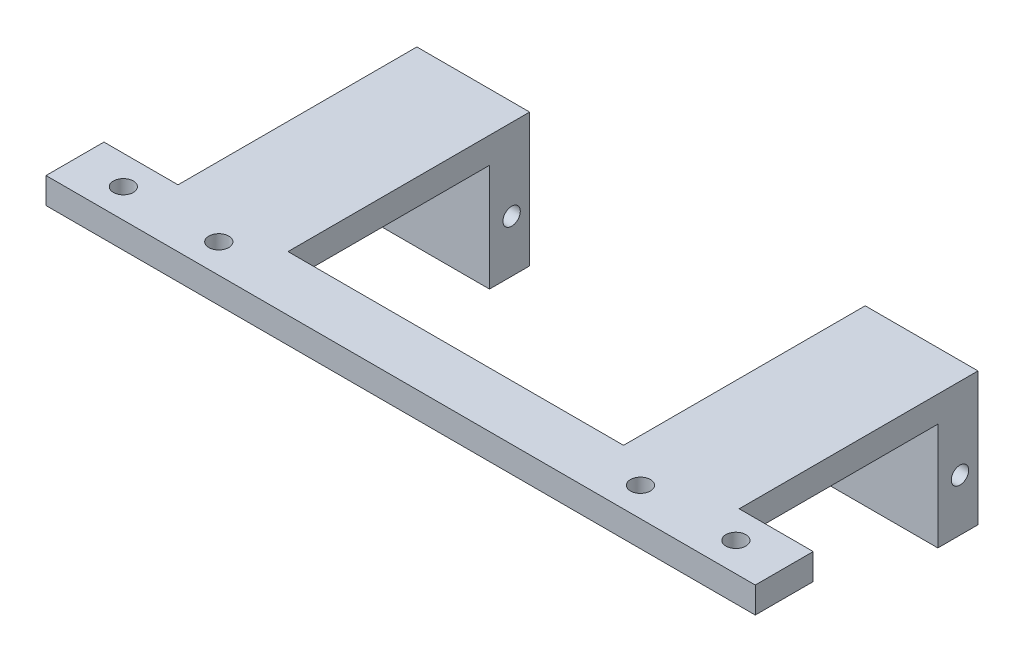
ISO-10303-21;
HEADER;
FILE_DESCRIPTION(('STEP AP214'),'2;1');
FILE_NAME('part.step','',(''),(''),'','','');
FILE_SCHEMA(('AUTOMOTIVE_DESIGN { 1 0 10303 214 1 1 1 1 }'));
ENDSEC;
DATA;
#1=APPLICATION_CONTEXT('core data for automotive mechanical design processes');
#2=APPLICATION_PROTOCOL_DEFINITION('international standard','automotive_design',2000,#1);
#3=PRODUCT_CONTEXT('',#1,'mechanical');
#4=PRODUCT('Part','Part','',(#3));
#5=PRODUCT_RELATED_PRODUCT_CATEGORY('part','',(#4));
#6=PRODUCT_DEFINITION_FORMATION('','',#4);
#7=PRODUCT_DEFINITION_CONTEXT('part definition',#1,'design');
#8=PRODUCT_DEFINITION('design','',#6,#7);
#9=PRODUCT_DEFINITION_SHAPE('','',#8);
#10=(LENGTH_UNIT() NAMED_UNIT(*) SI_UNIT(.MILLI.,.METRE.));
#11=(NAMED_UNIT(*) PLANE_ANGLE_UNIT() SI_UNIT($,.RADIAN.));
#12=(NAMED_UNIT(*) SI_UNIT($,.STERADIAN.) SOLID_ANGLE_UNIT());
#13=UNCERTAINTY_MEASURE_WITH_UNIT(LENGTH_MEASURE(1.E-05),#10,'distance_accuracy_value','');
#14=(GEOMETRIC_REPRESENTATION_CONTEXT(3) GLOBAL_UNCERTAINTY_ASSIGNED_CONTEXT((#13)) GLOBAL_UNIT_ASSIGNED_CONTEXT((#10,
#11,#12)) REPRESENTATION_CONTEXT('',''));
#15=CARTESIAN_POINT('',(0.,0.,0.));
#16=DIRECTION('',(0.,0.,1.));
#17=DIRECTION('',(1.,0.,0.));
#18=AXIS2_PLACEMENT_3D('',#15,#16,#17);
#19=CARTESIAN_POINT('',(32.5,70.4999984957278,6.27643567267014));
#20=DIRECTION('',(0.,1.,0.));
#21=DIRECTION('',(1.,0.,0.));
#22=AXIS2_PLACEMENT_3D('',#19,#20,#21);
#23=PLANE('',#22);
#24=CARTESIAN_POINT('',(56.8005550509677,70.4999984957278,20.0406324854805));
#25=DIRECTION('',(0.,-1.,0.));
#26=DIRECTION('',(1.,0.,0.));
#27=AXIS2_PLACEMENT_3D('',#24,#25,#26);
#28=CIRCLE('',#27,1.15);
#29=CARTESIAN_POINT('',(57.9505550509677,70.4999984957278,20.0406324854805));
#30=VERTEX_POINT('',#29);
#31=EDGE_CURVE('E11',#30,#30,#28,.T.);
#32=ORIENTED_EDGE('',*,*,#31,.T.);
#33=EDGE_LOOP('',(#32));
#34=FACE_BOUND('',#33,.T.);
#35=CARTESIAN_POINT('',(-2.8005550509677,70.4999984957278,20.0406324854805));
#36=DIRECTION('',(0.,-1.,0.));
#37=DIRECTION('',(1.,0.,0.));
#38=AXIS2_PLACEMENT_3D('',#35,#36,#37);
#39=CIRCLE('',#38,1.15);
#40=CARTESIAN_POINT('',(-1.6505550509677,70.4999984957278,20.0406324854805));
#41=VERTEX_POINT('',#40);
#42=EDGE_CURVE('E23',#41,#41,#39,.T.);
#43=ORIENTED_EDGE('',*,*,#42,.T.);
#44=EDGE_LOOP('',(#43));
#45=FACE_BOUND('',#44,.T.);
#46=CARTESIAN_POINT('',(67.8005550509677,70.4999984957278,20.0406324854805));
#47=DIRECTION('',(0.,-1.,0.));
#48=DIRECTION('',(1.,0.,0.));
#49=AXIS2_PLACEMENT_3D('',#46,#47,#48);
#50=CIRCLE('',#49,1.15);
#51=CARTESIAN_POINT('',(68.9505550509677,70.4999984957278,20.0406324854805));
#52=VERTEX_POINT('',#51);
#53=EDGE_CURVE('E325',#52,#52,#50,.T.);
#54=ORIENTED_EDGE('',*,*,#53,.T.);
#55=EDGE_LOOP('',(#54));
#56=FACE_BOUND('',#55,.T.);
#57=CARTESIAN_POINT('',(8.1994449490323,70.4999984957278,20.0406324854805));
#58=DIRECTION('',(0.,-1.,0.));
#59=DIRECTION('',(1.,0.,0.));
#60=AXIS2_PLACEMENT_3D('',#57,#58,#59);
#61=CIRCLE('',#60,1.15);
#62=CARTESIAN_POINT('',(9.3494449490323,70.4999984957278,20.0406324854805));
#63=VERTEX_POINT('',#62);
#64=EDGE_CURVE('E320',#63,#63,#61,.T.);
#65=ORIENTED_EDGE('',*,*,#64,.T.);
#66=EDGE_LOOP('',(#65));
#67=FACE_BOUND('',#66,.T.);
#68=DIRECTION('',(1.,0.,0.));
#69=VECTOR('',#68,1.);
#70=CARTESIAN_POINT('',(0.161137255349864,70.4999984957278,23.3812649709613));
#71=LINE('',#70,#69);
#72=CARTESIAN_POINT('',(-8.37603999629014,70.4999984957278,23.3812649709613));
#73=VERTEX_POINT('',#72);
#74=CARTESIAN_POINT('',(73.3760399962901,70.4999984957278,23.3812649709613));
#75=VERTEX_POINT('',#74);
#76=EDGE_CURVE('E30',#73,#75,#71,.T.);
#77=ORIENTED_EDGE('',*,*,#76,.T.);
#78=DIRECTION('',(0.,0.,-1.));
#79=VECTOR('',#78,1.);
#80=CARTESIAN_POINT('',(73.3760399962901,70.4999984957278,23.3812649709613));
#81=LINE('',#80,#79);
#82=CARTESIAN_POINT('',(73.3760399962901,70.4999984957278,16.6999999999997));
#83=VERTEX_POINT('',#82);
#84=EDGE_CURVE('E35',#75,#83,#81,.T.);
#85=ORIENTED_EDGE('',*,*,#84,.T.);
#86=DIRECTION('',(-1.,0.,0.));
#87=VECTOR('',#86,1.);
#88=CARTESIAN_POINT('',(32.5,70.4999984957278,16.6999999999997));
#89=LINE('',#88,#87);
#90=CARTESIAN_POINT('',(64.8388627446501,70.4999984957278,16.6999999999997));
#91=VERTEX_POINT('',#90);
#92=EDGE_CURVE('E314',#83,#91,#89,.T.);
#93=ORIENTED_EDGE('',*,*,#92,.T.);
#94=DIRECTION('',(0.,0.,-1.));
#95=VECTOR('',#94,1.);
#96=CARTESIAN_POINT('',(64.8388627446501,70.4999984957278,23.3812649709613));
#97=LINE('',#96,#95);
#98=CARTESIAN_POINT('',(64.8388627446501,70.4999984957278,-10.828393625621));
#99=VERTEX_POINT('',#98);
#100=EDGE_CURVE('E312',#91,#99,#97,.T.);
#101=ORIENTED_EDGE('',*,*,#100,.T.);
#102=DIRECTION('',(-1.,0.,0.));
#103=VECTOR('',#102,1.);
#104=CARTESIAN_POINT('',(32.5,70.4999984957278,-10.828393625621));
#105=LINE('',#104,#103);
#106=CARTESIAN_POINT('',(51.8388627446501,70.4999984957278,-10.828393625621));
#107=VERTEX_POINT('',#106);
#108=EDGE_CURVE('E308',#99,#107,#105,.T.);
#109=ORIENTED_EDGE('',*,*,#108,.T.);
#110=DIRECTION('',(0.,0.,1.));
#111=VECTOR('',#110,1.);
#112=CARTESIAN_POINT('',(51.8388627446501,70.4999984957278,-10.828393625621));
#113=LINE('',#112,#111);
#114=CARTESIAN_POINT('',(51.8388627446501,70.4999984957278,17.0268952281669));
#115=VERTEX_POINT('',#114);
#116=EDGE_CURVE('E304',#107,#115,#113,.T.);
#117=ORIENTED_EDGE('',*,*,#116,.T.);
#118=DIRECTION('',(-1.,0.,0.));
#119=VECTOR('',#118,1.);
#120=CARTESIAN_POINT('',(32.5,70.4999984957278,17.0268952281669));
#121=LINE('',#120,#119);
#122=CARTESIAN_POINT('',(13.1611372553499,70.4999984957278,17.0268952281669));
#123=VERTEX_POINT('',#122);
#124=EDGE_CURVE('E300',#115,#123,#121,.T.);
#125=ORIENTED_EDGE('',*,*,#124,.T.);
#126=DIRECTION('',(0.,0.,-1.));
#127=VECTOR('',#126,1.);
#128=CARTESIAN_POINT('',(13.1611372553499,70.4999984957278,23.3812649709613));
#129=LINE('',#128,#127);
#130=CARTESIAN_POINT('',(13.1611372553499,70.4999984957278,-10.828393625621));
#131=VERTEX_POINT('',#130);
#132=EDGE_CURVE('E296',#123,#131,#129,.T.);
#133=ORIENTED_EDGE('',*,*,#132,.T.);
#134=DIRECTION('',(-1.,0.,0.));
#135=VECTOR('',#134,1.);
#136=CARTESIAN_POINT('',(13.1611372553499,70.4999984957278,-10.828393625621));
#137=LINE('',#136,#135);
#138=CARTESIAN_POINT('',(0.161137255349866,70.4999984957278,-10.828393625621));
#139=VERTEX_POINT('',#138);
#140=EDGE_CURVE('E292',#131,#139,#137,.T.);
#141=ORIENTED_EDGE('',*,*,#140,.T.);
#142=DIRECTION('',(0.,0.,1.));
#143=VECTOR('',#142,1.);
#144=CARTESIAN_POINT('',(0.161137255349864,70.4999984957278,-10.828393625621));
#145=LINE('',#144,#143);
#146=CARTESIAN_POINT('',(0.161137255349866,70.4999984957278,16.6999999999997));
#147=VERTEX_POINT('',#146);
#148=EDGE_CURVE('E288',#139,#147,#145,.T.);
#149=ORIENTED_EDGE('',*,*,#148,.T.);
#150=DIRECTION('',(-1.,0.,0.));
#151=VECTOR('',#150,1.);
#152=CARTESIAN_POINT('',(-8.37603999629014,70.4999984957278,16.6999999999997));
#153=LINE('',#152,#151);
#154=CARTESIAN_POINT('',(-8.37603999629014,70.4999984957278,16.6999999999997));
#155=VERTEX_POINT('',#154);
#156=EDGE_CURVE('E284',#147,#155,#153,.T.);
#157=ORIENTED_EDGE('',*,*,#156,.T.);
#158=DIRECTION('',(0.,0.,1.));
#159=VECTOR('',#158,1.);
#160=CARTESIAN_POINT('',(-8.37603999629014,70.4999984957278,23.3812649709613));
#161=LINE('',#160,#159);
#162=EDGE_CURVE('E147',#155,#73,#161,.T.);
#163=ORIENTED_EDGE('',*,*,#162,.T.);
#164=EDGE_LOOP('',(#77,#85,#93,#101,#109,#117,#125,#133,#141,#149,#157,#163));
#165=FACE_BOUND('',#164,.T.);
#166=ADVANCED_FACE('F16',(#34,#45,#56,#67,#165),#23,.T.);
#167=CARTESIAN_POINT('',(-8.37603999629014,67.4999984957278,23.3812649709613));
#168=DIRECTION('',(0.,0.,1.));
#169=DIRECTION('',(1.,0.,0.));
#170=AXIS2_PLACEMENT_3D('',#167,#168,#169);
#171=PLANE('',#170);
#172=DIRECTION('',(-1.,0.,0.));
#173=VECTOR('',#172,1.);
#174=CARTESIAN_POINT('',(0.161137255349864,67.4999984957278,23.3812649709613));
#175=LINE('',#174,#173);
#176=CARTESIAN_POINT('',(73.3760399962901,67.4999984957278,23.3812649709613));
#177=VERTEX_POINT('',#176);
#178=CARTESIAN_POINT('',(-8.37603999629014,67.4999984957278,23.3812649709613));
#179=VERTEX_POINT('',#178);
#180=EDGE_CURVE('E152',#177,#179,#175,.T.);
#181=ORIENTED_EDGE('',*,*,#180,.F.);
#182=DIRECTION('',(0.,1.,0.));
#183=VECTOR('',#182,1.);
#184=CARTESIAN_POINT('',(73.3760399962901,67.4999984957278,23.3812649709613));
#185=LINE('',#184,#183);
#186=EDGE_CURVE('E274',#177,#75,#185,.T.);
#187=ORIENTED_EDGE('',*,*,#186,.T.);
#188=ORIENTED_EDGE('',*,*,#76,.F.);
#189=DIRECTION('',(0.,1.,0.));
#190=VECTOR('',#189,1.);
#191=CARTESIAN_POINT('',(-8.37603999629014,67.4999984957278,23.3812649709613));
#192=LINE('',#191,#190);
#193=EDGE_CURVE('E270',#179,#73,#192,.T.);
#194=ORIENTED_EDGE('',*,*,#193,.F.);
#195=EDGE_LOOP('',(#181,#187,#188,#194));
#196=FACE_BOUND('',#195,.T.);
#197=ADVANCED_FACE('F351',(#196),#171,.T.);
#198=CARTESIAN_POINT('',(73.3760399962901,67.4999984957278,23.3812649709613));
#199=DIRECTION('',(1.,0.,0.));
#200=DIRECTION('',(0.,0.,-1.));
#201=AXIS2_PLACEMENT_3D('',#198,#199,#200);
#202=PLANE('',#201);
#203=DIRECTION('',(0.,0.,-1.));
#204=VECTOR('',#203,1.);
#205=CARTESIAN_POINT('',(73.3760399962901,67.4999984957278,23.3812649709613));
#206=LINE('',#205,#204);
#207=CARTESIAN_POINT('',(73.3760399962901,67.4999984957278,16.6999999999997));
#208=VERTEX_POINT('',#207);
#209=EDGE_CURVE('E268',#177,#208,#206,.T.);
#210=ORIENTED_EDGE('',*,*,#209,.T.);
#211=DIRECTION('',(0.,1.,0.));
#212=VECTOR('',#211,1.);
#213=CARTESIAN_POINT('',(73.3760399962901,67.4999984957278,16.6999999999997));
#214=LINE('',#213,#212);
#215=EDGE_CURVE('E266',#208,#83,#214,.T.);
#216=ORIENTED_EDGE('',*,*,#215,.T.);
#217=ORIENTED_EDGE('',*,*,#84,.F.);
#218=ORIENTED_EDGE('',*,*,#186,.F.);
#219=EDGE_LOOP('',(#210,#216,#217,#218));
#220=FACE_BOUND('',#219,.T.);
#221=ADVANCED_FACE('F356',(#220),#202,.T.);
#222=CARTESIAN_POINT('',(0.161137255349864,67.4999984957278,16.6999999999997));
#223=DIRECTION('',(0.,0.,-1.));
#224=DIRECTION('',(-1.,0.,0.));
#225=AXIS2_PLACEMENT_3D('',#222,#223,#224);
#226=PLANE('',#225);
#227=DIRECTION('',(-1.,0.,0.));
#228=VECTOR('',#227,1.);
#229=CARTESIAN_POINT('',(0.161137255349864,67.4999984957278,16.6999999999997));
#230=LINE('',#229,#228);
#231=CARTESIAN_POINT('',(64.8388627446501,67.4999984957278,16.6999999999997));
#232=VERTEX_POINT('',#231);
#233=EDGE_CURVE('E264',#208,#232,#230,.T.);
#234=ORIENTED_EDGE('',*,*,#233,.T.);
#235=DIRECTION('',(0.,1.,0.));
#236=VECTOR('',#235,1.);
#237=CARTESIAN_POINT('',(64.8388627446501,67.4999984957278,16.6999999999997));
#238=LINE('',#237,#236);
#239=EDGE_CURVE('E261',#232,#91,#238,.T.);
#240=ORIENTED_EDGE('',*,*,#239,.T.);
#241=ORIENTED_EDGE('',*,*,#92,.F.);
#242=ORIENTED_EDGE('',*,*,#215,.F.);
#243=EDGE_LOOP('',(#234,#240,#241,#242));
#244=FACE_BOUND('',#243,.T.);
#245=ADVANCED_FACE('F363',(#244),#226,.T.);
#246=CARTESIAN_POINT('',(64.8388627446501,67.4999984957278,16.6999999999997));
#247=DIRECTION('',(1.,0.,0.));
#248=DIRECTION('',(0.,0.,-1.));
#249=AXIS2_PLACEMENT_3D('',#246,#247,#248);
#250=PLANE('',#249);
#251=CARTESIAN_POINT('',(64.8388627446501,61.1387157673979,-8.75));
#252=DIRECTION('',(-1.,0.,0.));
#253=DIRECTION('',(0.,1.,0.));
#254=AXIS2_PLACEMENT_3D('',#251,#252,#253);
#255=CIRCLE('',#254,1.);
#256=CARTESIAN_POINT('',(64.8388627446501,62.1387157673979,-8.75));
#257=VERTEX_POINT('',#256);
#258=EDGE_CURVE('E256',#257,#257,#255,.T.);
#259=ORIENTED_EDGE('',*,*,#258,.T.);
#260=EDGE_LOOP('',(#259));
#261=FACE_BOUND('',#260,.T.);
#262=DIRECTION('',(0.,0.,-1.));
#263=VECTOR('',#262,1.);
#264=CARTESIAN_POINT('',(64.8388627446501,67.4999984957278,23.3812649709613));
#265=LINE('',#264,#263);
#266=CARTESIAN_POINT('',(64.8388627446501,67.4999984957278,-6.20000000000025));
#267=VERTEX_POINT('',#266);
#268=EDGE_CURVE('E252',#232,#267,#265,.T.);
#269=ORIENTED_EDGE('',*,*,#268,.T.);
#270=DIRECTION('',(0.,-1.,0.));
#271=VECTOR('',#270,1.);
#272=CARTESIAN_POINT('',(64.8388627446501,67.4999984957278,-6.20000000000025));
#273=LINE('',#272,#271);
#274=CARTESIAN_POINT('',(64.8388627446501,55.1389984957278,-6.20000000000025));
#275=VERTEX_POINT('',#274);
#276=EDGE_CURVE('E248',#267,#275,#273,.T.);
#277=ORIENTED_EDGE('',*,*,#276,.T.);
#278=DIRECTION('',(0.,0.,1.));
#279=VECTOR('',#278,1.);
#280=CARTESIAN_POINT('',(64.8388627446501,55.1389984957278,-6.20000000000025));
#281=LINE('',#280,#279);
#282=CARTESIAN_POINT('',(64.8388627446501,55.1389984957278,-10.828393625621));
#283=VERTEX_POINT('',#282);
#284=EDGE_CURVE('E245',#283,#275,#281,.T.);
#285=ORIENTED_EDGE('',*,*,#284,.F.);
#286=DIRECTION('',(0.,1.,0.));
#287=VECTOR('',#286,1.);
#288=CARTESIAN_POINT('',(64.8388627446501,67.4999984957278,-10.828393625621));
#289=LINE('',#288,#287);
#290=EDGE_CURVE('E242',#283,#99,#289,.T.);
#291=ORIENTED_EDGE('',*,*,#290,.T.);
#292=ORIENTED_EDGE('',*,*,#100,.F.);
#293=ORIENTED_EDGE('',*,*,#239,.F.);
#294=EDGE_LOOP('',(#269,#277,#285,#291,#292,#293));
#295=FACE_BOUND('',#294,.T.);
#296=ADVANCED_FACE('F370',(#261,#295),#250,.T.);
#297=CARTESIAN_POINT('',(13.1611372553499,67.4999984957278,-10.828393625621));
#298=DIRECTION('',(0.,0.,-1.));
#299=DIRECTION('',(-1.,0.,0.));
#300=AXIS2_PLACEMENT_3D('',#297,#298,#299);
#301=PLANE('',#300);
#302=DIRECTION('',(0.,1.,0.));
#303=VECTOR('',#302,1.);
#304=CARTESIAN_POINT('',(51.8388627446501,67.4999984957278,-10.828393625621));
#305=LINE('',#304,#303);
#306=CARTESIAN_POINT('',(51.8388627446502,55.1389984957278,-10.828393625621));
#307=VERTEX_POINT('',#306);
#308=EDGE_CURVE('E239',#307,#107,#305,.T.);
#309=ORIENTED_EDGE('',*,*,#308,.T.);
#310=ORIENTED_EDGE('',*,*,#108,.F.);
#311=ORIENTED_EDGE('',*,*,#290,.F.);
#312=DIRECTION('',(1.,0.,0.));
#313=VECTOR('',#312,1.);
#314=CARTESIAN_POINT('',(58.3388627446502,55.1389984957278,-10.828393625621));
#315=LINE('',#314,#313);
#316=EDGE_CURVE('E236',#307,#283,#315,.T.);
#317=ORIENTED_EDGE('',*,*,#316,.F.);
#318=EDGE_LOOP('',(#309,#310,#311,#317));
#319=FACE_BOUND('',#318,.T.);
#320=ADVANCED_FACE('F373',(#319),#301,.T.);
#321=CARTESIAN_POINT('',(51.8388627446501,67.4999984957278,-10.828393625621));
#322=DIRECTION('',(-1.,0.,0.));
#323=DIRECTION('',(0.,0.,1.));
#324=AXIS2_PLACEMENT_3D('',#321,#322,#323);
#325=PLANE('',#324);
#326=CARTESIAN_POINT('',(51.8388627446501,61.1387157673979,-8.75));
#327=DIRECTION('',(1.,0.,0.));
#328=DIRECTION('',(0.,1.,0.));
#329=AXIS2_PLACEMENT_3D('',#326,#327,#328);
#330=CIRCLE('',#329,1.);
#331=CARTESIAN_POINT('',(51.8388627446501,62.1387157673979,-8.75));
#332=VERTEX_POINT('',#331);
#333=EDGE_CURVE('E231',#332,#332,#330,.T.);
#334=ORIENTED_EDGE('',*,*,#333,.T.);
#335=EDGE_LOOP('',(#334));
#336=FACE_BOUND('',#335,.T.);
#337=DIRECTION('',(0.,0.,1.));
#338=VECTOR('',#337,1.);
#339=CARTESIAN_POINT('',(51.8388627446501,67.4999984957278,-10.828393625621));
#340=LINE('',#339,#338);
#341=CARTESIAN_POINT('',(51.8388627446502,67.4999984957278,-6.20000000000025));
#342=VERTEX_POINT('',#341);
#343=CARTESIAN_POINT('',(51.8388627446501,67.4999984957278,17.0268952281669));
#344=VERTEX_POINT('',#343);
#345=EDGE_CURVE('E227',#342,#344,#340,.T.);
#346=ORIENTED_EDGE('',*,*,#345,.T.);
#347=DIRECTION('',(0.,1.,0.));
#348=VECTOR('',#347,1.);
#349=CARTESIAN_POINT('',(51.8388627446501,67.4999984957278,17.0268952281669));
#350=LINE('',#349,#348);
#351=EDGE_CURVE('E222',#344,#115,#350,.T.);
#352=ORIENTED_EDGE('',*,*,#351,.T.);
#353=ORIENTED_EDGE('',*,*,#116,.F.);
#354=ORIENTED_EDGE('',*,*,#308,.F.);
#355=DIRECTION('',(0.,0.,-1.));
#356=VECTOR('',#355,1.);
#357=CARTESIAN_POINT('',(51.8388627446502,55.1389984957278,-10.828393625621));
#358=LINE('',#357,#356);
#359=CARTESIAN_POINT('',(51.8388627446502,55.1389984957278,-6.20000000000025));
#360=VERTEX_POINT('',#359);
#361=EDGE_CURVE('E217',#360,#307,#358,.T.);
#362=ORIENTED_EDGE('',*,*,#361,.F.);
#363=DIRECTION('',(0.,-1.,0.));
#364=VECTOR('',#363,1.);
#365=CARTESIAN_POINT('',(51.8388627446502,67.4999984957278,-6.20000000000025));
#366=LINE('',#365,#364);
#367=EDGE_CURVE('E212',#342,#360,#366,.T.);
#368=ORIENTED_EDGE('',*,*,#367,.F.);
#369=EDGE_LOOP('',(#346,#352,#353,#354,#362,#368));
#370=FACE_BOUND('',#369,.T.);
#371=ADVANCED_FACE('F380',(#336,#370),#325,.T.);
#372=CARTESIAN_POINT('',(51.8388627446501,67.4999984957278,17.0268952281669));
#373=DIRECTION('',(0.,0.,-1.));
#374=DIRECTION('',(-1.,0.,0.));
#375=AXIS2_PLACEMENT_3D('',#372,#373,#374);
#376=PLANE('',#375);
#377=DIRECTION('',(1.,0.,0.));
#378=VECTOR('',#377,1.);
#379=CARTESIAN_POINT('',(32.5,67.4999984957278,17.0268952281669));
#380=LINE('',#379,#378);
#381=CARTESIAN_POINT('',(13.1611372553499,67.4999984957278,17.0268952281669));
#382=VERTEX_POINT('',#381);
#383=EDGE_CURVE('E207',#382,#344,#380,.T.);
#384=ORIENTED_EDGE('',*,*,#383,.F.);
#385=DIRECTION('',(0.,1.,0.));
#386=VECTOR('',#385,1.);
#387=CARTESIAN_POINT('',(13.1611372553499,67.4999984957278,17.0268952281669));
#388=LINE('',#387,#386);
#389=EDGE_CURVE('E204',#382,#123,#388,.T.);
#390=ORIENTED_EDGE('',*,*,#389,.T.);
#391=ORIENTED_EDGE('',*,*,#124,.F.);
#392=ORIENTED_EDGE('',*,*,#351,.F.);
#393=EDGE_LOOP('',(#384,#390,#391,#392));
#394=FACE_BOUND('',#393,.T.);
#395=ADVANCED_FACE('F383',(#394),#376,.T.);
#396=CARTESIAN_POINT('',(13.1611372553499,67.4999984957278,17.0268952281669));
#397=DIRECTION('',(1.,0.,0.));
#398=DIRECTION('',(0.,0.,-1.));
#399=AXIS2_PLACEMENT_3D('',#396,#397,#398);
#400=PLANE('',#399);
#401=CARTESIAN_POINT('',(13.1611372553499,61.1387157673979,-8.75));
#402=DIRECTION('',(-1.,0.,0.));
#403=DIRECTION('',(0.,1.,0.));
#404=AXIS2_PLACEMENT_3D('',#401,#402,#403);
#405=CIRCLE('',#404,1.);
#406=CARTESIAN_POINT('',(13.1611372553499,62.1387157673979,-8.75));
#407=VERTEX_POINT('',#406);
#408=EDGE_CURVE('E199',#407,#407,#405,.T.);
#409=ORIENTED_EDGE('',*,*,#408,.T.);
#410=EDGE_LOOP('',(#409));
#411=FACE_BOUND('',#410,.T.);
#412=DIRECTION('',(0.,0.,-1.));
#413=VECTOR('',#412,1.);
#414=CARTESIAN_POINT('',(13.1611372553499,67.4999984957278,23.3812649709613));
#415=LINE('',#414,#413);
#416=CARTESIAN_POINT('',(13.1611372553499,67.4999984957278,-6.20000000000025));
#417=VERTEX_POINT('',#416);
#418=EDGE_CURVE('E197',#382,#417,#415,.T.);
#419=ORIENTED_EDGE('',*,*,#418,.T.);
#420=DIRECTION('',(0.,-1.,0.));
#421=VECTOR('',#420,1.);
#422=CARTESIAN_POINT('',(13.1611372553499,67.4999984957278,-6.20000000000025));
#423=LINE('',#422,#421);
#424=CARTESIAN_POINT('',(13.1611372553499,55.1389984957278,-6.20000000000025));
#425=VERTEX_POINT('',#424);
#426=EDGE_CURVE('E195',#417,#425,#423,.T.);
#427=ORIENTED_EDGE('',*,*,#426,.T.);
#428=DIRECTION('',(0.,0.,1.));
#429=VECTOR('',#428,1.);
#430=CARTESIAN_POINT('',(13.1611372553499,55.1389984957278,-8.51419681281063));
#431=LINE('',#430,#429);
#432=CARTESIAN_POINT('',(13.1611372553499,55.1389984957278,-10.828393625621));
#433=VERTEX_POINT('',#432);
#434=EDGE_CURVE('E190',#433,#425,#431,.T.);
#435=ORIENTED_EDGE('',*,*,#434,.F.);
#436=DIRECTION('',(0.,1.,0.));
#437=VECTOR('',#436,1.);
#438=CARTESIAN_POINT('',(13.1611372553499,67.4999984957278,-10.828393625621));
#439=LINE('',#438,#437);
#440=EDGE_CURVE('E185',#433,#131,#439,.T.);
#441=ORIENTED_EDGE('',*,*,#440,.T.);
#442=ORIENTED_EDGE('',*,*,#132,.F.);
#443=ORIENTED_EDGE('',*,*,#389,.F.);
#444=EDGE_LOOP('',(#419,#427,#435,#441,#442,#443));
#445=FACE_BOUND('',#444,.T.);
#446=ADVANCED_FACE('F378',(#411,#445),#400,.T.);
#447=DIRECTION('',(0.,1.,0.));
#448=VECTOR('',#447,1.);
#449=CARTESIAN_POINT('',(0.161137255349864,67.4999984957278,-10.828393625621));
#450=LINE('',#449,#448);
#451=CARTESIAN_POINT('',(0.161137255349864,55.1389984957278,-10.828393625621));
#452=VERTEX_POINT('',#451);
#453=EDGE_CURVE('E182',#452,#139,#450,.T.);
#454=ORIENTED_EDGE('',*,*,#453,.T.);
#455=ORIENTED_EDGE('',*,*,#140,.F.);
#456=ORIENTED_EDGE('',*,*,#440,.F.);
#457=EDGE_CURVE('E181',#452,#433,#315,.T.);
#458=ORIENTED_EDGE('',*,*,#457,.F.);
#459=EDGE_LOOP('',(#454,#455,#456,#458));
#460=FACE_BOUND('',#459,.T.);
#461=ADVANCED_FACE('F375',(#460),#301,.T.);
#462=CARTESIAN_POINT('',(0.161137255349864,67.4999984957278,-10.828393625621));
#463=DIRECTION('',(-1.,0.,0.));
#464=DIRECTION('',(0.,0.,1.));
#465=AXIS2_PLACEMENT_3D('',#462,#463,#464);
#466=PLANE('',#465);
#467=CARTESIAN_POINT('',(0.161137255349864,61.1387157673979,-8.75));
#468=DIRECTION('',(1.,0.,0.));
#469=DIRECTION('',(0.,1.,0.));
#470=AXIS2_PLACEMENT_3D('',#467,#468,#469);
#471=CIRCLE('',#470,1.);
#472=CARTESIAN_POINT('',(0.161137255349864,62.1387157673979,-8.75));
#473=VERTEX_POINT('',#472);
#474=EDGE_CURVE('E176',#473,#473,#471,.T.);
#475=ORIENTED_EDGE('',*,*,#474,.T.);
#476=EDGE_LOOP('',(#475));
#477=FACE_BOUND('',#476,.T.);
#478=DIRECTION('',(0.,0.,1.));
#479=VECTOR('',#478,1.);
#480=CARTESIAN_POINT('',(0.161137255349864,67.4999984957278,-10.828393625621));
#481=LINE('',#480,#479);
#482=CARTESIAN_POINT('',(0.161137255349864,67.4999984957278,-6.20000000000025));
#483=VERTEX_POINT('',#482);
#484=CARTESIAN_POINT('',(0.161137255349864,67.4999984957278,16.6999999999997));
#485=VERTEX_POINT('',#484);
#486=EDGE_CURVE('E172',#483,#485,#481,.T.);
#487=ORIENTED_EDGE('',*,*,#486,.T.);
#488=DIRECTION('',(0.,1.,0.));
#489=VECTOR('',#488,1.);
#490=CARTESIAN_POINT('',(0.161137255349864,67.4999984957278,16.6999999999997));
#491=LINE('',#490,#489);
#492=EDGE_CURVE('E135',#485,#147,#491,.T.);
#493=ORIENTED_EDGE('',*,*,#492,.T.);
#494=ORIENTED_EDGE('',*,*,#148,.F.);
#495=ORIENTED_EDGE('',*,*,#453,.F.);
#496=DIRECTION('',(0.,0.,-1.));
#497=VECTOR('',#496,1.);
#498=CARTESIAN_POINT('',(0.161137255349865,55.1389984957278,-8.51419681281063));
#499=LINE('',#498,#497);
#500=CARTESIAN_POINT('',(0.161137255349864,55.1389984957278,-6.20000000000025));
#501=VERTEX_POINT('',#500);
#502=EDGE_CURVE('E168',#501,#452,#499,.T.);
#503=ORIENTED_EDGE('',*,*,#502,.F.);
#504=DIRECTION('',(0.,-1.,0.));
#505=VECTOR('',#504,1.);
#506=CARTESIAN_POINT('',(0.161137255349858,67.4999984957278,-6.20000000000025));
#507=LINE('',#506,#505);
#508=EDGE_CURVE('E139',#483,#501,#507,.T.);
#509=ORIENTED_EDGE('',*,*,#508,.F.);
#510=EDGE_LOOP('',(#487,#493,#494,#495,#503,#509));
#511=FACE_BOUND('',#510,.T.);
#512=ADVANCED_FACE('F369',(#477,#511),#466,.T.);
#513=DIRECTION('',(1.,0.,0.));
#514=VECTOR('',#513,1.);
#515=CARTESIAN_POINT('',(-8.37603999629014,67.4999984957278,16.6999999999997));
#516=LINE('',#515,#514);
#517=CARTESIAN_POINT('',(-8.37603999629014,67.4999984957278,16.6999999999997));
#518=VERTEX_POINT('',#517);
#519=EDGE_CURVE('E128',#518,#485,#516,.T.);
#520=ORIENTED_EDGE('',*,*,#519,.F.);
#521=DIRECTION('',(0.,1.,0.));
#522=VECTOR('',#521,1.);
#523=CARTESIAN_POINT('',(-8.37603999629014,67.4999984957278,16.6999999999997));
#524=LINE('',#523,#522);
#525=EDGE_CURVE('E132',#518,#155,#524,.T.);
#526=ORIENTED_EDGE('',*,*,#525,.T.);
#527=ORIENTED_EDGE('',*,*,#156,.F.);
#528=ORIENTED_EDGE('',*,*,#492,.F.);
#529=EDGE_LOOP('',(#520,#526,#527,#528));
#530=FACE_BOUND('',#529,.T.);
#531=ADVANCED_FACE('F130',(#530),#226,.T.);
#532=CARTESIAN_POINT('',(-8.37603999629014,67.4999984957278,16.6999999999997));
#533=DIRECTION('',(-1.,0.,0.));
#534=DIRECTION('',(0.,0.,1.));
#535=AXIS2_PLACEMENT_3D('',#532,#533,#534);
#536=PLANE('',#535);
#537=DIRECTION('',(0.,0.,-1.));
#538=VECTOR('',#537,1.);
#539=CARTESIAN_POINT('',(-8.37603999629014,67.4999984957278,23.3812649709613));
#540=LINE('',#539,#538);
#541=EDGE_CURVE('E145',#179,#518,#540,.T.);
#542=ORIENTED_EDGE('',*,*,#541,.F.);
#543=ORIENTED_EDGE('',*,*,#193,.T.);
#544=ORIENTED_EDGE('',*,*,#162,.F.);
#545=ORIENTED_EDGE('',*,*,#525,.F.);
#546=EDGE_LOOP('',(#542,#543,#544,#545));
#547=FACE_BOUND('',#546,.T.);
#548=ADVANCED_FACE('F143',(#547),#536,.T.);
#549=CARTESIAN_POINT('',(58.3388627446502,55.1389984957278,-8.51419681281063));
#550=DIRECTION('',(0.,-1.,0.));
#551=DIRECTION('',(-1.,0.,0.));
#552=AXIS2_PLACEMENT_3D('',#549,#550,#551);
#553=PLANE('',#552);
#554=ORIENTED_EDGE('',*,*,#502,.T.);
#555=ORIENTED_EDGE('',*,*,#457,.T.);
#556=ORIENTED_EDGE('',*,*,#434,.T.);
#557=DIRECTION('',(-1.,0.,0.));
#558=VECTOR('',#557,1.);
#559=CARTESIAN_POINT('',(58.3388627446502,55.1389984957278,-6.20000000000025));
#560=LINE('',#559,#558);
#561=EDGE_CURVE('E153',#425,#501,#560,.T.);
#562=ORIENTED_EDGE('',*,*,#561,.T.);
#563=EDGE_LOOP('',(#554,#555,#556,#562));
#564=FACE_BOUND('',#563,.T.);
#565=ADVANCED_FACE('F396',(#564),#553,.T.);
#566=CARTESIAN_POINT('',(64.8388627446501,67.4999984957278,-6.20000000000025));
#567=DIRECTION('',(0.,0.,1.));
#568=DIRECTION('',(-1.,0.,0.));
#569=AXIS2_PLACEMENT_3D('',#566,#567,#568);
#570=PLANE('',#569);
#571=DIRECTION('',(1.,0.,0.));
#572=VECTOR('',#571,1.);
#573=CARTESIAN_POINT('',(32.5,67.4999984957278,-6.20000000000025));
#574=LINE('',#573,#572);
#575=EDGE_CURVE('E156',#483,#417,#574,.T.);
#576=ORIENTED_EDGE('',*,*,#575,.F.);
#577=ORIENTED_EDGE('',*,*,#508,.T.);
#578=ORIENTED_EDGE('',*,*,#561,.F.);
#579=ORIENTED_EDGE('',*,*,#426,.F.);
#580=EDGE_LOOP('',(#576,#577,#578,#579));
#581=FACE_BOUND('',#580,.T.);
#582=ADVANCED_FACE('F404',(#581),#570,.T.);
#583=CARTESIAN_POINT('',(32.5,67.4999984957278,6.27643567267014));
#584=DIRECTION('',(0.,1.,0.));
#585=DIRECTION('',(1.,0.,0.));
#586=AXIS2_PLACEMENT_3D('',#583,#584,#585);
#587=PLANE('',#586);
#588=CARTESIAN_POINT('',(56.8005550509677,67.4999984957278,20.0406324854805));
#589=DIRECTION('',(0.,1.,0.));
#590=DIRECTION('',(1.,0.,0.));
#591=AXIS2_PLACEMENT_3D('',#588,#589,#590);
#592=CIRCLE('',#591,1.15);
#593=CARTESIAN_POINT('',(57.9505550509677,67.4999984957278,20.0406324854805));
#594=VERTEX_POINT('',#593);
#595=EDGE_CURVE('E414',#594,#594,#592,.T.);
#596=ORIENTED_EDGE('',*,*,#595,.T.);
#597=EDGE_LOOP('',(#596));
#598=FACE_BOUND('',#597,.T.);
#599=CARTESIAN_POINT('',(-2.8005550509677,67.4999984957278,20.0406324854805));
#600=DIRECTION('',(0.,1.,0.));
#601=DIRECTION('',(1.,0.,0.));
#602=AXIS2_PLACEMENT_3D('',#599,#600,#601);
#603=CIRCLE('',#602,1.15);
#604=CARTESIAN_POINT('',(-1.6505550509677,67.4999984957278,20.0406324854805));
#605=VERTEX_POINT('',#604);
#606=EDGE_CURVE('E417',#605,#605,#603,.T.);
#607=ORIENTED_EDGE('',*,*,#606,.T.);
#608=EDGE_LOOP('',(#607));
#609=FACE_BOUND('',#608,.T.);
#610=CARTESIAN_POINT('',(67.8005550509677,67.4999984957278,20.0406324854805));
#611=DIRECTION('',(0.,1.,0.));
#612=DIRECTION('',(1.,0.,0.));
#613=AXIS2_PLACEMENT_3D('',#610,#611,#612);
#614=CIRCLE('',#613,1.15);
#615=CARTESIAN_POINT('',(68.9505550509677,67.4999984957278,20.0406324854805));
#616=VERTEX_POINT('',#615);
#617=EDGE_CURVE('E421',#616,#616,#614,.T.);
#618=ORIENTED_EDGE('',*,*,#617,.T.);
#619=EDGE_LOOP('',(#618));
#620=FACE_BOUND('',#619,.T.);
#621=CARTESIAN_POINT('',(8.1994449490323,67.4999984957278,20.0406324854805));
#622=DIRECTION('',(0.,1.,0.));
#623=DIRECTION('',(1.,0.,0.));
#624=AXIS2_PLACEMENT_3D('',#621,#622,#623);
#625=CIRCLE('',#624,1.15);
#626=CARTESIAN_POINT('',(9.3494449490323,67.4999984957278,20.0406324854805));
#627=VERTEX_POINT('',#626);
#628=EDGE_CURVE('E424',#627,#627,#625,.T.);
#629=ORIENTED_EDGE('',*,*,#628,.T.);
#630=EDGE_LOOP('',(#629));
#631=FACE_BOUND('',#630,.T.);
#632=DIRECTION('',(1.,0.,0.));
#633=VECTOR('',#632,1.);
#634=CARTESIAN_POINT('',(48.6694313723251,67.4999984957278,-6.20000000000025));
#635=LINE('',#634,#633);
#636=EDGE_CURVE('E426',#342,#267,#635,.T.);
#637=ORIENTED_EDGE('',*,*,#636,.T.);
#638=ORIENTED_EDGE('',*,*,#268,.F.);
#639=ORIENTED_EDGE('',*,*,#233,.F.);
#640=ORIENTED_EDGE('',*,*,#209,.F.);
#641=ORIENTED_EDGE('',*,*,#180,.T.);
#642=ORIENTED_EDGE('',*,*,#541,.T.);
#643=ORIENTED_EDGE('',*,*,#519,.T.);
#644=ORIENTED_EDGE('',*,*,#486,.F.);
#645=ORIENTED_EDGE('',*,*,#575,.T.);
#646=ORIENTED_EDGE('',*,*,#418,.F.);
#647=ORIENTED_EDGE('',*,*,#383,.T.);
#648=ORIENTED_EDGE('',*,*,#345,.F.);
#649=EDGE_LOOP('',(#637,#638,#639,#640,#641,#642,#643,#644,#645,#646,#647,#648));
#650=FACE_BOUND('',#649,.T.);
#651=ADVANCED_FACE('F150',(#598,#609,#620,#631,#650),#587,.F.);
#652=DIRECTION('',(-1.,0.,0.));
#653=VECTOR('',#652,1.);
#654=CARTESIAN_POINT('',(51.8388627446502,55.1389984957278,-6.20000000000025));
#655=LINE('',#654,#653);
#656=EDGE_CURVE('E429',#275,#360,#655,.T.);
#657=ORIENTED_EDGE('',*,*,#656,.T.);
#658=ORIENTED_EDGE('',*,*,#361,.T.);
#659=ORIENTED_EDGE('',*,*,#316,.T.);
#660=ORIENTED_EDGE('',*,*,#284,.T.);
#661=EDGE_LOOP('',(#657,#658,#659,#660));
#662=FACE_BOUND('',#661,.T.);
#663=ADVANCED_FACE('F397',(#662),#553,.T.);
#664=ORIENTED_EDGE('',*,*,#636,.F.);
#665=ORIENTED_EDGE('',*,*,#367,.T.);
#666=ORIENTED_EDGE('',*,*,#656,.F.);
#667=ORIENTED_EDGE('',*,*,#276,.F.);
#668=EDGE_LOOP('',(#664,#665,#666,#667));
#669=FACE_BOUND('',#668,.T.);
#670=ADVANCED_FACE('F346',(#669),#570,.T.);
#671=CARTESIAN_POINT('',(56.8005550509677,70.4999984957278,20.0406324854805));
#672=DIRECTION('',(0.,-1.,0.));
#673=DIRECTION('',(1.,0.,0.));
#674=AXIS2_PLACEMENT_3D('',#671,#672,#673);
#675=CYLINDRICAL_SURFACE('',#674,1.15);
#676=ORIENTED_EDGE('',*,*,#595,.F.);
#677=EDGE_LOOP('',(#676));
#678=FACE_BOUND('',#677,.T.);
#679=ORIENTED_EDGE('',*,*,#31,.F.);
#680=EDGE_LOOP('',(#679));
#681=FACE_BOUND('',#680,.T.);
#682=ADVANCED_FACE('F335',(#678,#681),#675,.F.);
#683=CARTESIAN_POINT('',(-2.8005550509677,70.4999984957278,20.0406324854805));
#684=DIRECTION('',(0.,-1.,0.));
#685=DIRECTION('',(1.,0.,0.));
#686=AXIS2_PLACEMENT_3D('',#683,#684,#685);
#687=CYLINDRICAL_SURFACE('',#686,1.15);
#688=ORIENTED_EDGE('',*,*,#606,.F.);
#689=EDGE_LOOP('',(#688));
#690=FACE_BOUND('',#689,.T.);
#691=ORIENTED_EDGE('',*,*,#42,.F.);
#692=EDGE_LOOP('',(#691));
#693=FACE_BOUND('',#692,.T.);
#694=ADVANCED_FACE('F332',(#690,#693),#687,.F.);
#695=CARTESIAN_POINT('',(67.8005550509677,70.4999984957278,20.0406324854805));
#696=DIRECTION('',(0.,-1.,0.));
#697=DIRECTION('',(1.,0.,0.));
#698=AXIS2_PLACEMENT_3D('',#695,#696,#697);
#699=CYLINDRICAL_SURFACE('',#698,1.15);
#700=ORIENTED_EDGE('',*,*,#617,.F.);
#701=EDGE_LOOP('',(#700));
#702=FACE_BOUND('',#701,.T.);
#703=ORIENTED_EDGE('',*,*,#53,.F.);
#704=EDGE_LOOP('',(#703));
#705=FACE_BOUND('',#704,.T.);
#706=ADVANCED_FACE('F334',(#702,#705),#699,.F.);
#707=CARTESIAN_POINT('',(8.1994449490323,70.4999984957278,20.0406324854805));
#708=DIRECTION('',(0.,-1.,0.));
#709=DIRECTION('',(1.,0.,0.));
#710=AXIS2_PLACEMENT_3D('',#707,#708,#709);
#711=CYLINDRICAL_SURFACE('',#710,1.15);
#712=ORIENTED_EDGE('',*,*,#628,.F.);
#713=EDGE_LOOP('',(#712));
#714=FACE_BOUND('',#713,.T.);
#715=ORIENTED_EDGE('',*,*,#64,.F.);
#716=EDGE_LOOP('',(#715));
#717=FACE_BOUND('',#716,.T.);
#718=ADVANCED_FACE('F343',(#714,#717),#711,.F.);
#719=CARTESIAN_POINT('',(0.161137255349864,61.1387157673979,-8.75));
#720=DIRECTION('',(1.,0.,0.));
#721=DIRECTION('',(0.,1.,0.));
#722=AXIS2_PLACEMENT_3D('',#719,#720,#721);
#723=CYLINDRICAL_SURFACE('',#722,1.);
#724=ORIENTED_EDGE('',*,*,#408,.F.);
#725=EDGE_LOOP('',(#724));
#726=FACE_BOUND('',#725,.T.);
#727=ORIENTED_EDGE('',*,*,#474,.F.);
#728=EDGE_LOOP('',(#727));
#729=FACE_BOUND('',#728,.T.);
#730=ADVANCED_FACE('F582',(#726,#729),#723,.F.);
#731=ORIENTED_EDGE('',*,*,#258,.F.);
#732=EDGE_LOOP('',(#731));
#733=FACE_BOUND('',#732,.T.);
#734=ORIENTED_EDGE('',*,*,#333,.F.);
#735=EDGE_LOOP('',(#734));
#736=FACE_BOUND('',#735,.T.);
#737=ADVANCED_FACE('F592',(#733,#736),#723,.F.);
#738=CLOSED_SHELL('',(#166,#197,#221,#245,#296,#320,#371,#395,#446,#461,#512,#531,#548,#565,
#582,#651,#663,#670,#682,#694,#706,#718,#730,#737));
#739=MANIFOLD_SOLID_BREP('B1',#738);
#740=ADVANCED_BREP_SHAPE_REPRESENTATION('',(#18,#739),#14);
#741=SHAPE_DEFINITION_REPRESENTATION(#9,#740);
ENDSEC;
END-ISO-10303-21;
